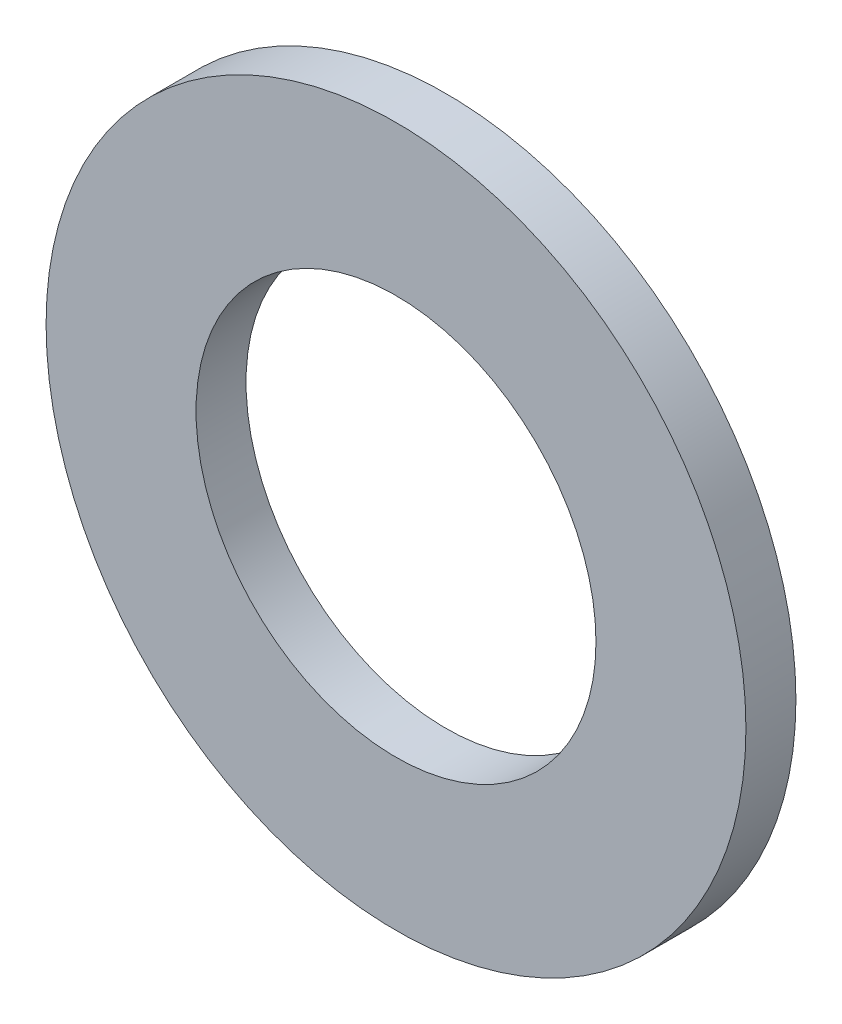
ISO-10303-21;
HEADER;
FILE_DESCRIPTION(('STEP AP214'),'2;1');
FILE_NAME('part.step','',(''),(''),'','','');
FILE_SCHEMA(('AUTOMOTIVE_DESIGN { 1 0 10303 214 1 1 1 1 }'));
ENDSEC;
DATA;
#1=APPLICATION_CONTEXT('core data for automotive mechanical design processes');
#2=APPLICATION_PROTOCOL_DEFINITION('international standard','automotive_design',2000,#1);
#3=PRODUCT_CONTEXT('',#1,'mechanical');
#4=PRODUCT('Part','Part','',(#3));
#5=PRODUCT_RELATED_PRODUCT_CATEGORY('part','',(#4));
#6=PRODUCT_DEFINITION_FORMATION('','',#4);
#7=PRODUCT_DEFINITION_CONTEXT('part definition',#1,'design');
#8=PRODUCT_DEFINITION('design','',#6,#7);
#9=PRODUCT_DEFINITION_SHAPE('','',#8);
#10=(LENGTH_UNIT() NAMED_UNIT(*) SI_UNIT(.MILLI.,.METRE.));
#11=(NAMED_UNIT(*) PLANE_ANGLE_UNIT() SI_UNIT($,.RADIAN.));
#12=(NAMED_UNIT(*) SI_UNIT($,.STERADIAN.) SOLID_ANGLE_UNIT());
#13=UNCERTAINTY_MEASURE_WITH_UNIT(LENGTH_MEASURE(1.E-05),#10,'distance_accuracy_value','');
#14=(GEOMETRIC_REPRESENTATION_CONTEXT(3) GLOBAL_UNCERTAINTY_ASSIGNED_CONTEXT((#13)) GLOBAL_UNIT_ASSIGNED_CONTEXT((#10,
#11,#12)) REPRESENTATION_CONTEXT('',''));
#15=CARTESIAN_POINT('',(0.,0.,0.));
#16=DIRECTION('',(0.,0.,1.));
#17=DIRECTION('',(1.,0.,0.));
#18=AXIS2_PLACEMENT_3D('',#15,#16,#17);
#19=CARTESIAN_POINT('',(0.,0.,0.5));
#20=DIRECTION('',(0.,0.,1.));
#21=DIRECTION('',(1.,0.,0.));
#22=AXIS2_PLACEMENT_3D('',#19,#20,#21);
#23=PLANE('',#22);
#24=CARTESIAN_POINT('',(0.,0.,0.5));
#25=DIRECTION('',(0.,0.,1.));
#26=DIRECTION('',(1.,0.,0.));
#27=AXIS2_PLACEMENT_3D('',#24,#25,#26);
#28=CIRCLE('',#27,3.5);
#29=CARTESIAN_POINT('',(3.5,0.,0.5));
#30=VERTEX_POINT('',#29);
#31=EDGE_CURVE('E10',#30,#30,#28,.T.);
#32=ORIENTED_EDGE('',*,*,#31,.T.);
#33=EDGE_LOOP('',(#32));
#34=FACE_BOUND('',#33,.T.);
#35=CARTESIAN_POINT('',(0.,0.,0.5));
#36=DIRECTION('',(0.,0.,1.));
#37=DIRECTION('',(1.,0.,0.));
#38=AXIS2_PLACEMENT_3D('',#35,#36,#37);
#39=CIRCLE('',#38,2.);
#40=CARTESIAN_POINT('',(2.,0.,0.5));
#41=VERTEX_POINT('',#40);
#42=EDGE_CURVE('E43',#41,#41,#39,.T.);
#43=ORIENTED_EDGE('',*,*,#42,.F.);
#44=EDGE_LOOP('',(#43));
#45=FACE_BOUND('',#44,.T.);
#46=ADVANCED_FACE('F32',(#34,#45),#23,.T.);
#47=CARTESIAN_POINT('',(0.,0.,0.));
#48=DIRECTION('',(0.,0.,1.));
#49=DIRECTION('',(1.,0.,0.));
#50=AXIS2_PLACEMENT_3D('',#47,#48,#49);
#51=PLANE('',#50);
#52=CARTESIAN_POINT('',(0.,0.,0.));
#53=DIRECTION('',(0.,0.,1.));
#54=DIRECTION('',(1.,0.,0.));
#55=AXIS2_PLACEMENT_3D('',#52,#53,#54);
#56=CIRCLE('',#55,3.5);
#57=CARTESIAN_POINT('',(3.5,0.,0.));
#58=VERTEX_POINT('',#57);
#59=EDGE_CURVE('E36',#58,#58,#56,.T.);
#60=ORIENTED_EDGE('',*,*,#59,.F.);
#61=EDGE_LOOP('',(#60));
#62=FACE_BOUND('',#61,.T.);
#63=CARTESIAN_POINT('',(0.,0.,0.));
#64=DIRECTION('',(0.,0.,1.));
#65=DIRECTION('',(1.,0.,0.));
#66=AXIS2_PLACEMENT_3D('',#63,#64,#65);
#67=CIRCLE('',#66,2.);
#68=CARTESIAN_POINT('',(2.,0.,0.));
#69=VERTEX_POINT('',#68);
#70=EDGE_CURVE('E45',#69,#69,#67,.T.);
#71=ORIENTED_EDGE('',*,*,#70,.T.);
#72=EDGE_LOOP('',(#71));
#73=FACE_BOUND('',#72,.T.);
#74=ADVANCED_FACE('F55',(#62,#73),#51,.F.);
#75=CARTESIAN_POINT('',(0.,0.,0.5));
#76=DIRECTION('',(0.,0.,-1.));
#77=DIRECTION('',(-1.,0.,0.));
#78=AXIS2_PLACEMENT_3D('',#75,#76,#77);
#79=CYLINDRICAL_SURFACE('',#78,3.5);
#80=ORIENTED_EDGE('',*,*,#31,.F.);
#81=EDGE_LOOP('',(#80));
#82=FACE_BOUND('',#81,.T.);
#83=ORIENTED_EDGE('',*,*,#59,.T.);
#84=EDGE_LOOP('',(#83));
#85=FACE_BOUND('',#84,.T.);
#86=ADVANCED_FACE('F34',(#82,#85),#79,.T.);
#87=CARTESIAN_POINT('',(0.,0.,0.5));
#88=DIRECTION('',(0.,0.,-1.));
#89=DIRECTION('',(-1.,0.,0.));
#90=AXIS2_PLACEMENT_3D('',#87,#88,#89);
#91=CYLINDRICAL_SURFACE('',#90,2.);
#92=ORIENTED_EDGE('',*,*,#42,.T.);
#93=EDGE_LOOP('',(#92));
#94=FACE_BOUND('',#93,.T.);
#95=ORIENTED_EDGE('',*,*,#70,.F.);
#96=EDGE_LOOP('',(#95));
#97=FACE_BOUND('',#96,.T.);
#98=ADVANCED_FACE('F51',(#94,#97),#91,.F.);
#99=CLOSED_SHELL('',(#46,#74,#86,#98));
#100=MANIFOLD_SOLID_BREP('B2',#99);
#101=ADVANCED_BREP_SHAPE_REPRESENTATION('',(#18,#100),#14);
#102=SHAPE_DEFINITION_REPRESENTATION(#9,#101);
ENDSEC;
END-ISO-10303-21;
